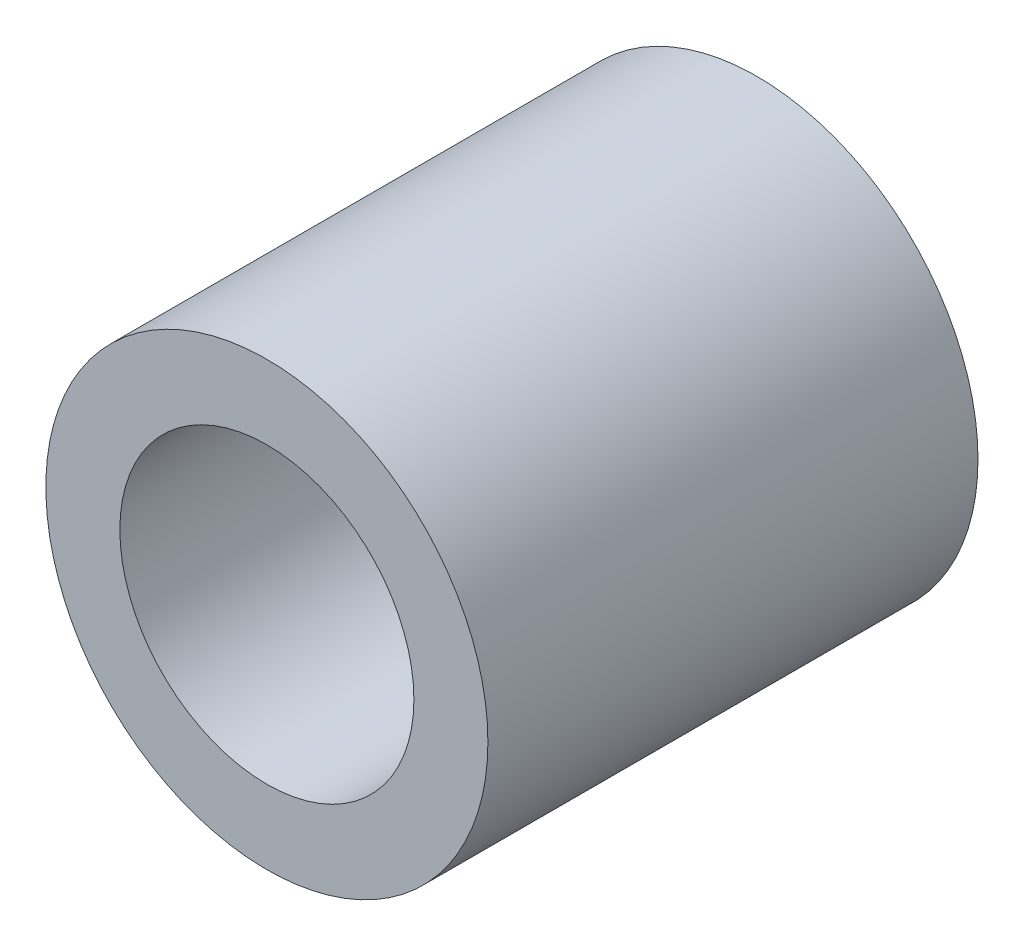
ISO-10303-21;
HEADER;
FILE_DESCRIPTION(('STEP AP214'),'2;1');
FILE_NAME('part.step','',(''),(''),'','','');
FILE_SCHEMA(('AUTOMOTIVE_DESIGN { 1 0 10303 214 1 1 1 1 }'));
ENDSEC;
DATA;
#1=APPLICATION_CONTEXT('core data for automotive mechanical design processes');
#2=APPLICATION_PROTOCOL_DEFINITION('international standard','automotive_design',2000,#1);
#3=PRODUCT_CONTEXT('',#1,'mechanical');
#4=PRODUCT('Part','Part','',(#3));
#5=PRODUCT_RELATED_PRODUCT_CATEGORY('part','',(#4));
#6=PRODUCT_DEFINITION_FORMATION('','',#4);
#7=PRODUCT_DEFINITION_CONTEXT('part definition',#1,'design');
#8=PRODUCT_DEFINITION('design','',#6,#7);
#9=PRODUCT_DEFINITION_SHAPE('','',#8);
#10=(LENGTH_UNIT() NAMED_UNIT(*) SI_UNIT(.MILLI.,.METRE.));
#11=(NAMED_UNIT(*) PLANE_ANGLE_UNIT() SI_UNIT($,.RADIAN.));
#12=(NAMED_UNIT(*) SI_UNIT($,.STERADIAN.) SOLID_ANGLE_UNIT());
#13=UNCERTAINTY_MEASURE_WITH_UNIT(LENGTH_MEASURE(1.E-05),#10,'distance_accuracy_value','');
#14=(GEOMETRIC_REPRESENTATION_CONTEXT(3) GLOBAL_UNCERTAINTY_ASSIGNED_CONTEXT((#13)) GLOBAL_UNIT_ASSIGNED_CONTEXT((#10,
#11,#12)) REPRESENTATION_CONTEXT('',''));
#15=CARTESIAN_POINT('',(0.,0.,0.));
#16=DIRECTION('',(0.,0.,1.));
#17=DIRECTION('',(1.,0.,0.));
#18=AXIS2_PLACEMENT_3D('',#15,#16,#17);
#19=CARTESIAN_POINT('',(0.,0.,5.));
#20=DIRECTION('',(0.,0.,1.));
#21=DIRECTION('',(0.999999999999999,0.,0.));
#22=AXIS2_PLACEMENT_3D('',#19,#20,#21);
#23=PLANE('',#22);
#24=CARTESIAN_POINT('',(0.,0.,5.));
#25=DIRECTION('',(0.,0.,1.));
#26=DIRECTION('',(0.999999999999999,0.,0.));
#27=AXIS2_PLACEMENT_3D('',#24,#25,#26);
#28=CIRCLE('',#27,4.51);
#29=CARTESIAN_POINT('',(4.51,0.,5.));
#30=VERTEX_POINT('',#29);
#31=EDGE_CURVE('E10',#30,#30,#28,.T.);
#32=ORIENTED_EDGE('',*,*,#31,.T.);
#33=EDGE_LOOP('',(#32));
#34=FACE_BOUND('',#33,.T.);
#35=CARTESIAN_POINT('',(0.,0.,5.));
#36=DIRECTION('',(0.,0.,1.));
#37=DIRECTION('',(0.999999999999999,0.,0.));
#38=AXIS2_PLACEMENT_3D('',#35,#36,#37);
#39=CIRCLE('',#38,3.);
#40=CARTESIAN_POINT('',(3.,0.,5.));
#41=VERTEX_POINT('',#40);
#42=EDGE_CURVE('E48',#41,#41,#39,.T.);
#43=ORIENTED_EDGE('',*,*,#42,.F.);
#44=EDGE_LOOP('',(#43));
#45=FACE_BOUND('',#44,.T.);
#46=ADVANCED_FACE('F37',(#34,#45),#23,.T.);
#47=CARTESIAN_POINT('',(0.,0.,-4.99999999999995));
#48=DIRECTION('',(0.,0.,1.));
#49=DIRECTION('',(0.999999999999999,0.,0.));
#50=AXIS2_PLACEMENT_3D('',#47,#48,#49);
#51=PLANE('',#50);
#52=CARTESIAN_POINT('',(0.,0.,-4.99999999999995));
#53=DIRECTION('',(0.,0.,1.));
#54=DIRECTION('',(0.999999999999999,0.,0.));
#55=AXIS2_PLACEMENT_3D('',#52,#53,#54);
#56=CIRCLE('',#55,4.51);
#57=CARTESIAN_POINT('',(4.51,0.,-4.99999999999995));
#58=VERTEX_POINT('',#57);
#59=EDGE_CURVE('E41',#58,#58,#56,.T.);
#60=ORIENTED_EDGE('',*,*,#59,.F.);
#61=EDGE_LOOP('',(#60));
#62=FACE_BOUND('',#61,.T.);
#63=CARTESIAN_POINT('',(0.,0.,-4.99999999999995));
#64=DIRECTION('',(0.,0.,1.));
#65=DIRECTION('',(0.999999999999999,0.,0.));
#66=AXIS2_PLACEMENT_3D('',#63,#64,#65);
#67=CIRCLE('',#66,3.);
#68=CARTESIAN_POINT('',(3.,0.,-4.99999999999995));
#69=VERTEX_POINT('',#68);
#70=EDGE_CURVE('E50',#69,#69,#67,.T.);
#71=ORIENTED_EDGE('',*,*,#70,.T.);
#72=EDGE_LOOP('',(#71));
#73=FACE_BOUND('',#72,.T.);
#74=ADVANCED_FACE('F60',(#62,#73),#51,.F.);
#75=CARTESIAN_POINT('',(0.,0.,5.));
#76=DIRECTION('',(0.,0.,-1.));
#77=DIRECTION('',(-0.999999999999999,0.,0.));
#78=AXIS2_PLACEMENT_3D('',#75,#76,#77);
#79=CYLINDRICAL_SURFACE('',#78,4.51);
#80=ORIENTED_EDGE('',*,*,#31,.F.);
#81=EDGE_LOOP('',(#80));
#82=FACE_BOUND('',#81,.T.);
#83=ORIENTED_EDGE('',*,*,#59,.T.);
#84=EDGE_LOOP('',(#83));
#85=FACE_BOUND('',#84,.T.);
#86=ADVANCED_FACE('F39',(#82,#85),#79,.T.);
#87=CARTESIAN_POINT('',(0.,0.,5.));
#88=DIRECTION('',(0.,0.,-1.));
#89=DIRECTION('',(-0.999999999999999,0.,0.));
#90=AXIS2_PLACEMENT_3D('',#87,#88,#89);
#91=CYLINDRICAL_SURFACE('',#90,3.);
#92=ORIENTED_EDGE('',*,*,#42,.T.);
#93=EDGE_LOOP('',(#92));
#94=FACE_BOUND('',#93,.T.);
#95=ORIENTED_EDGE('',*,*,#70,.F.);
#96=EDGE_LOOP('',(#95));
#97=FACE_BOUND('',#96,.T.);
#98=ADVANCED_FACE('F56',(#94,#97),#91,.F.);
#99=CLOSED_SHELL('',(#46,#74,#86,#98));
#100=MANIFOLD_SOLID_BREP('B2',#99);
#101=ADVANCED_BREP_SHAPE_REPRESENTATION('',(#18,#100),#14);
#102=SHAPE_DEFINITION_REPRESENTATION(#9,#101);
ENDSEC;
END-ISO-10303-21;
